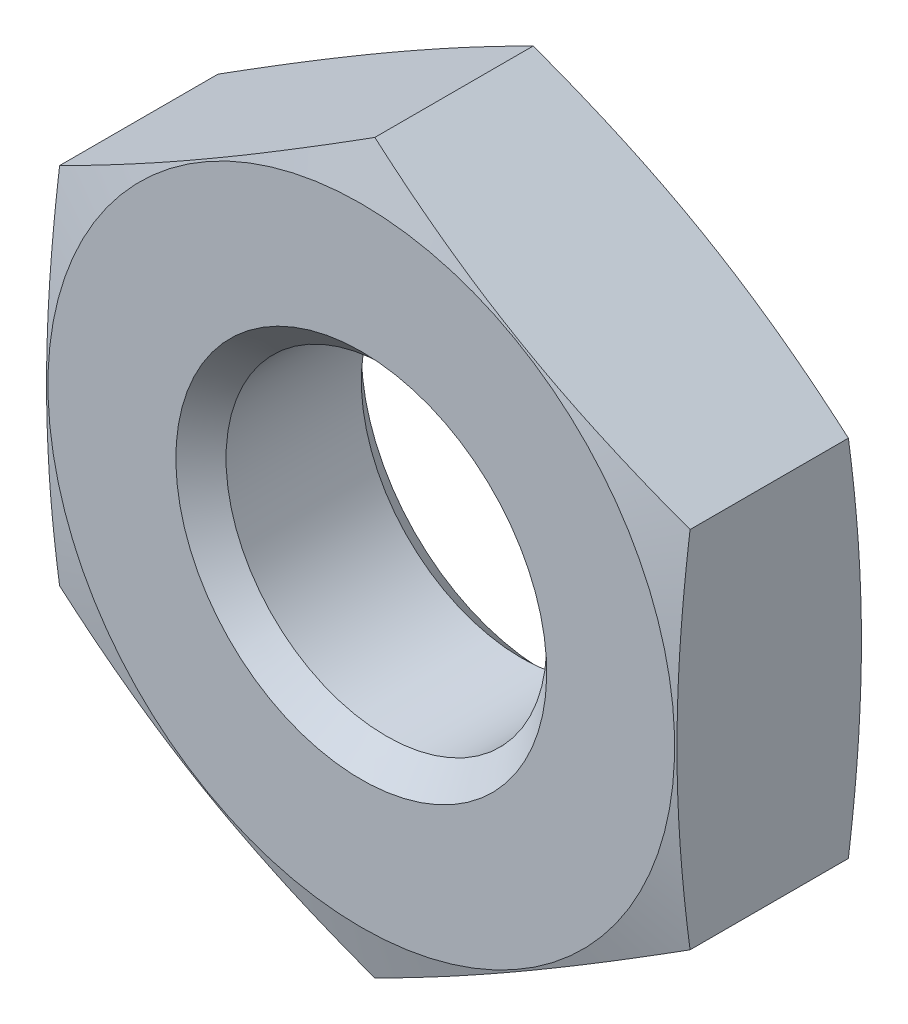
ISO-10303-21;
HEADER;
FILE_DESCRIPTION(('STEP AP214'),'2;1');
FILE_NAME('part.step','',(''),(''),'','','');
FILE_SCHEMA(('AUTOMOTIVE_DESIGN { 1 0 10303 214 1 1 1 1 }'));
ENDSEC;
DATA;
#1=APPLICATION_CONTEXT('core data for automotive mechanical design processes');
#2=APPLICATION_PROTOCOL_DEFINITION('international standard','automotive_design',2000,#1);
#3=PRODUCT_CONTEXT('',#1,'mechanical');
#4=PRODUCT('Part','Part','',(#3));
#5=PRODUCT_RELATED_PRODUCT_CATEGORY('part','',(#4));
#6=PRODUCT_DEFINITION_FORMATION('','',#4);
#7=PRODUCT_DEFINITION_CONTEXT('part definition',#1,'design');
#8=PRODUCT_DEFINITION('design','',#6,#7);
#9=PRODUCT_DEFINITION_SHAPE('','',#8);
#10=(LENGTH_UNIT() NAMED_UNIT(*) SI_UNIT(.MILLI.,.METRE.));
#11=(NAMED_UNIT(*) PLANE_ANGLE_UNIT() SI_UNIT($,.RADIAN.));
#12=(NAMED_UNIT(*) SI_UNIT($,.STERADIAN.) SOLID_ANGLE_UNIT());
#13=UNCERTAINTY_MEASURE_WITH_UNIT(LENGTH_MEASURE(1.E-05),#10,'distance_accuracy_value','');
#14=(GEOMETRIC_REPRESENTATION_CONTEXT(3) GLOBAL_UNCERTAINTY_ASSIGNED_CONTEXT((#13)) GLOBAL_UNIT_ASSIGNED_CONTEXT((#10,
#11,#12)) REPRESENTATION_CONTEXT('',''));
#15=CARTESIAN_POINT('',(0.,0.,0.));
#16=DIRECTION('',(0.,0.,1.));
#17=DIRECTION('',(1.,0.,0.));
#18=AXIS2_PLACEMENT_3D('',#15,#16,#17);
#19=CARTESIAN_POINT('',(-8.5,4.90747728811182,6.667));
#20=DIRECTION('',(0.5,-0.866025403784439,0.));
#21=DIRECTION('',(0.,0.,-1.));
#22=AXIS2_PLACEMENT_3D('',#19,#20,#21);
#23=PLANE('',#22);
#24=DIRECTION('',(0.,0.,1.));
#25=VECTOR('',#24,1.);
#26=CARTESIAN_POINT('',(-8.5,4.90747728811182,6.667));
#27=LINE('',#26,#25);
#28=CARTESIAN_POINT('',(-8.5,4.90747728811182,13.0327384764043));
#29=VERTEX_POINT('',#28);
#30=CARTESIAN_POINT('',(-8.5,4.90747728811182,17.3012615235957));
#31=VERTEX_POINT('',#30);
#32=EDGE_CURVE('E320',#29,#31,#27,.T.);
#33=ORIENTED_EDGE('',*,*,#32,.T.);
#34=CARTESIAN_POINT('',(0.,9.8149545762236,17.3012615235957));
#35=CARTESIAN_POINT('',(-0.180898159269028,9.71049903042365,17.3292495193082));
#36=CARTESIAN_POINT('',(-0.361941476855366,9.60593547794812,17.3559282074359));
#37=CARTESIAN_POINT('',(-0.720772382831821,9.3987083914887,17.4058769582953));
#38=CARTESIAN_POINT('',(-0.898553890734686,9.29604798273623,17.429203791207));
#39=CARTESIAN_POINT('',(-1.2517845161137,9.09215663528056,17.4724577700686));
#40=CARTESIAN_POINT('',(-1.4272288981087,8.99092719945775,17.492430409726));
#41=CARTESIAN_POINT('',(-1.77679219288645,8.78930186741603,17.5289781492053));
#42=CARTESIAN_POINT('',(-1.95090851688554,8.68890683472686,17.5455827096214));
#43=CARTESIAN_POINT('',(-2.30395826228766,8.48499972915376,17.575898136473));
#44=CARTESIAN_POINT('',(-2.48289358300263,8.38147730397616,17.5895177594154));
#45=CARTESIAN_POINT('',(-2.83836839128861,8.17583836719582,17.6128140992932));
#46=CARTESIAN_POINT('',(-3.01490507328591,8.07372319200837,17.6225450281326));
#47=CARTESIAN_POINT('',(-3.36736349614584,7.87014774309225,17.6380829550083));
#48=CARTESIAN_POINT('',(-3.5432839584829,7.76868672870259,17.6439091275708));
#49=CARTESIAN_POINT('',(-3.8961685465165,7.56527886711899,17.6516789870862));
#50=CARTESIAN_POINT('',(-4.0731332772547,7.4633322841041,17.6536020066666));
#51=CARTESIAN_POINT('',(-4.42683570929424,7.25911748625929,17.6536030739966));
#52=CARTESIAN_POINT('',(-4.60357344496381,7.15684933096186,17.6516817959));
#53=CARTESIAN_POINT('',(-4.95613035482277,6.95297033344451,17.6439142323722));
#54=CARTESIAN_POINT('',(-5.13194958103846,6.85135881453642,17.6380881724111));
#55=CARTESIAN_POINT('',(-5.48448350667436,6.6479156011383,17.6225500401738));
#56=CARTESIAN_POINT('',(-5.66119820803533,6.54608541931318,17.6128183352907));
#57=CARTESIAN_POINT('',(-6.01706616059865,6.34103095552903,17.5895204893277));
#58=CARTESIAN_POINT('',(-6.19621677787224,6.23780835556398,17.5758997087963));
#59=CARTESIAN_POINT('',(-6.54934245420602,6.03399476285778,17.5455851249058));
#60=CARTESIAN_POINT('',(-6.72332754931658,5.93340737887139,17.5289834579142));
#61=CARTESIAN_POINT('',(-7.07269906090232,5.73149793709869,17.4924394176123));
#62=CARTESIAN_POINT('',(-7.24808345207368,5.63017775260714,17.4724673957204));
#63=CARTESIAN_POINT('',(-7.60127478856458,5.42622048801649,17.4292132859889));
#64=CARTESIAN_POINT('',(-7.77907805845976,5.32358678644414,17.4058855204568));
#65=CARTESIAN_POINT('',(-8.13798035486786,5.11643522180768,17.3559333691342));
#66=CARTESIAN_POINT('',(-8.31907360797217,5.0119210591139,17.3292520336606));
#67=CARTESIAN_POINT('',(-8.49999999999997,4.90747728811179,17.3012615235957));
#68=B_SPLINE_CURVE_WITH_KNOTS('',3,(#34,#35,#36,#37,#38,#39,#40,#41,#42,#43,#44,#45,#46,#47,#48,
#49,#50,#51,#52,#53,#54,#55,#56,#57,#58,#59,#60,#61,#62,#63,#64,#65,#66,#67),.UNSPECIFIED.,.F.,
.F.,(4,2,2,2,2,2,2,2,2,2,2,2,2,2,2,2,4),(0.,0.6322725144393,1.25209623484148,1.86268064846303,
2.46766909863855,3.08915310428067,3.70164253008657,4.3111018132926,4.92377987966843,
5.53635051339146,6.14577250718081,6.75829705553949,7.37989066836482,7.98482616627779,
8.59539073500997,9.21523114762044,9.84755986695798),.UNSPECIFIED.);
#69=CARTESIAN_POINT('',(0.,9.81495457622364,17.3012615235957));
#70=VERTEX_POINT('',#69);
#71=EDGE_CURVE('E323',#70,#31,#68,.T.);
#72=ORIENTED_EDGE('',*,*,#71,.F.);
#73=DIRECTION('',(0.,0.,1.));
#74=VECTOR('',#73,1.);
#75=CARTESIAN_POINT('',(0.,9.81495457622364,6.667));
#76=LINE('',#75,#74);
#77=CARTESIAN_POINT('',(0.,9.81495457622364,13.0327384764043));
#78=VERTEX_POINT('',#77);
#79=EDGE_CURVE('E143',#78,#70,#76,.T.);
#80=ORIENTED_EDGE('',*,*,#79,.F.);
#81=CARTESIAN_POINT('',(-8.49999999999996,4.90747728811179,13.0327384764043));
#82=CARTESIAN_POINT('',(-8.3190897641333,5.0119119166385,13.0047504806912));
#83=CARTESIAN_POINT('',(-8.138013412583,5.11641825261747,12.978071792563));
#84=CARTESIAN_POINT('',(-7.7791340383641,5.32356138962803,12.928123041703));
#85=CARTESIAN_POINT('',(-7.60133676246893,5.42619448741889,12.9047962087911));
#86=CARTESIAN_POINT('',(-7.2481463632708,5.63015550866323,12.8615422299294));
#87=CARTESIAN_POINT('',(-7.07275690924101,5.7314800825099,12.8415695902722));
#88=CARTESIAN_POINT('',(-6.72336260226203,5.93339810999537,12.8050218507936));
#89=CARTESIAN_POINT('',(-6.54935979154338,6.0339897534466,12.788417290378));
#90=CARTESIAN_POINT('',(-6.19624618540725,6.23778624897839,12.7581018635272));
#91=CARTESIAN_POINT('',(-6.01712547498451,6.34098756976451,12.7444822405851));
#92=CARTESIAN_POINT('',(-5.66129952758222,6.54601831575713,12.7211859007076));
#93=CARTESIAN_POINT('',(-5.48459685075912,6.64784597947319,12.7114549718683));
#94=CARTESIAN_POINT('',(-5.1320661289808,6.85129620298954,12.6959170449926));
#95=CARTESIAN_POINT('',(-4.95623808185713,6.95291728522372,12.69009087243));
#96=CARTESIAN_POINT('',(-4.60363941237973,7.15682037227122,12.6823210129143));
#97=CARTESIAN_POINT('',(-4.42686871629094,7.25910303315552,12.6803979933335));
#98=CARTESIAN_POINT('',(-4.07316229751431,7.46331092575477,12.6803969260032));
#99=CARTESIAN_POINT('',(-3.896226609199,7.56523621699975,12.6823182040995));
#100=CARTESIAN_POINT('',(-3.54338376312884,7.76861995845468,12.690085767627));
#101=CARTESIAN_POINT('',(-3.36747599333167,7.87007811537665,12.695911827588));
#102=CARTESIAN_POINT('',(-3.01502203948417,8.07365984397521,12.7114499598254));
#103=CARTESIAN_POINT('',(-2.8384771644697,8.17578417366501,12.7211816647086));
#104=CARTESIAN_POINT('',(-2.48296081338422,8.38144762908967,12.7444795106718));
#105=CARTESIAN_POINT('',(-2.3039921109271,8.48498531477229,12.7581002912034));
#106=CARTESIAN_POINT('',(-1.95092152383663,8.68889432485275,12.7884148750937));
#107=CARTESIAN_POINT('',(-1.7768177464514,8.78927614510256,12.8050165420847));
#108=CARTESIAN_POINT('',(-1.42727328482315,8.99088602860501,12.8415605823859));
#109=CARTESIAN_POINT('',(-1.25183523555291,9.09211327454047,12.8615326042777));
#110=CARTESIAN_POINT('',(-0.89860739488612,9.29600731204336,12.9047867140092));
#111=CARTESIAN_POINT('',(-0.720822367091751,9.39867260986332,12.9281144795414));
#112=CARTESIAN_POINT('',(-0.361972701475146,9.60591533371416,12.9780666308648));
#113=CARTESIAN_POINT('',(-0.180914154971916,9.71048961001167,13.0047479663388));
#114=CARTESIAN_POINT('',(0.,9.8149545762236,13.0327384764043));
#115=B_SPLINE_CURVE_WITH_KNOTS('',3,(#81,#82,#83,#84,#85,#86,#87,#88,#89,#90,#91,#92,#93,#94,
#95,#96,#97,#98,#99,#100,#101,#102,#103,#104,#105,#106,#107,#108,#109,#110,#111,#112,#113,#114),
.UNSPECIFIED.,.F.,.F.,(4,2,2,2,2,2,2,2,2,2,2,2,2,2,2,2,4),(0.,0.632272514450517,
1.25209623485603,1.86268064847362,2.46766909863858,3.08915310428301,3.70164253008991,
4.31110181329527,4.92377987966839,5.5363505133726,6.14577250715544,6.75829705552028,
7.37989066836476,7.98482616626732,8.5953907349956,9.21523114760935,9.84755986695794),.UNSPECIFIED.);
#116=EDGE_CURVE('E324',#29,#78,#115,.T.);
#117=ORIENTED_EDGE('',*,*,#116,.F.);
#118=EDGE_LOOP('',(#33,#72,#80,#117));
#119=FACE_BOUND('',#118,.T.);
#120=ADVANCED_FACE('F16',(#119),#23,.F.);
#121=CARTESIAN_POINT('',(0.,0.,12.667));
#122=DIRECTION('',(0.,0.,-1.));
#123=DIRECTION('',(0.,-1.,0.));
#124=AXIS2_PLACEMENT_3D('',#121,#122,#123);
#125=CONICAL_SURFACE('',#124,5.,0.785398163397448);
#126=CARTESIAN_POINT('',(0.,0.,13.3435));
#127=DIRECTION('',(0.,0.,1.));
#128=DIRECTION('',(0.,1.,0.));
#129=AXIS2_PLACEMENT_3D('',#126,#127,#128);
#130=CIRCLE('',#129,4.3235);
#131=CARTESIAN_POINT('',(0.,4.3235,13.3435));
#132=VERTEX_POINT('',#131);
#133=EDGE_CURVE('E11',#132,#132,#130,.T.);
#134=ORIENTED_EDGE('',*,*,#133,.T.);
#135=EDGE_LOOP('',(#134));
#136=FACE_BOUND('',#135,.T.);
#137=CARTESIAN_POINT('',(0.,0.,12.667));
#138=DIRECTION('',(0.,0.,1.));
#139=DIRECTION('',(0.,1.,0.));
#140=AXIS2_PLACEMENT_3D('',#137,#138,#139);
#141=CIRCLE('',#140,5.);
#142=CARTESIAN_POINT('',(0.,5.,12.667));
#143=VERTEX_POINT('',#142);
#144=EDGE_CURVE('E102',#143,#143,#141,.T.);
#145=ORIENTED_EDGE('',*,*,#144,.F.);
#146=EDGE_LOOP('',(#145));
#147=FACE_BOUND('',#146,.T.);
#148=ADVANCED_FACE('F183',(#136,#147),#125,.F.);
#149=CARTESIAN_POINT('',(0.,0.,17.667));
#150=DIRECTION('',(0.,0.,-1.));
#151=DIRECTION('',(0.,1.,0.));
#152=AXIS2_PLACEMENT_3D('',#149,#150,#151);
#153=CYLINDRICAL_SURFACE('',#152,4.3235);
#154=CARTESIAN_POINT('',(0.,0.,16.9905));
#155=DIRECTION('',(0.,0.,1.));
#156=DIRECTION('',(0.,1.,0.));
#157=AXIS2_PLACEMENT_3D('',#154,#155,#156);
#158=CIRCLE('',#157,4.3235);
#159=CARTESIAN_POINT('',(0.,4.3235,16.9905));
#160=VERTEX_POINT('',#159);
#161=EDGE_CURVE('E29',#160,#160,#158,.T.);
#162=ORIENTED_EDGE('',*,*,#161,.T.);
#163=EDGE_LOOP('',(#162));
#164=FACE_BOUND('',#163,.T.);
#165=ORIENTED_EDGE('',*,*,#133,.F.);
#166=EDGE_LOOP('',(#165));
#167=FACE_BOUND('',#166,.T.);
#168=ADVANCED_FACE('F231',(#164,#167),#153,.F.);
#169=CARTESIAN_POINT('',(0.,0.,16.9905));
#170=DIRECTION('',(0.,0.,1.));
#171=DIRECTION('',(0.,1.,0.));
#172=AXIS2_PLACEMENT_3D('',#169,#170,#171);
#173=CONICAL_SURFACE('',#172,4.3235,0.785398163397448);
#174=ORIENTED_EDGE('',*,*,#161,.F.);
#175=EDGE_LOOP('',(#174));
#176=FACE_BOUND('',#175,.T.);
#177=CARTESIAN_POINT('',(0.,0.,17.667));
#178=DIRECTION('',(0.,0.,1.));
#179=DIRECTION('',(0.,1.,0.));
#180=AXIS2_PLACEMENT_3D('',#177,#178,#179);
#181=CIRCLE('',#180,5.);
#182=CARTESIAN_POINT('',(0.,5.,17.667));
#183=VERTEX_POINT('',#182);
#184=EDGE_CURVE('E127',#183,#183,#181,.T.);
#185=ORIENTED_EDGE('',*,*,#184,.T.);
#186=EDGE_LOOP('',(#185));
#187=FACE_BOUND('',#186,.T.);
#188=ADVANCED_FACE('F181',(#176,#187),#173,.F.);
#189=CARTESIAN_POINT('',(0.,0.,12.667));
#190=DIRECTION('',(0.,0.,1.));
#191=DIRECTION('',(0.,1.,0.));
#192=AXIS2_PLACEMENT_3D('',#189,#190,#191);
#193=CONICAL_SURFACE('',#192,8.45,1.30899693899575);
#194=CARTESIAN_POINT('',(0.,0.,12.667));
#195=DIRECTION('',(0.,0.,1.));
#196=DIRECTION('',(0.,1.,0.));
#197=AXIS2_PLACEMENT_3D('',#194,#195,#196);
#198=CIRCLE('',#197,8.45);
#199=CARTESIAN_POINT('',(0.,8.45,12.667));
#200=VERTEX_POINT('',#199);
#201=EDGE_CURVE('E95',#200,#200,#198,.T.);
#202=ORIENTED_EDGE('',*,*,#201,.T.);
#203=EDGE_LOOP('',(#202));
#204=FACE_BOUND('',#203,.T.);
#205=CARTESIAN_POINT('',(-8.50000000000001,-4.90747728811181,13.0327384764043));
#206=CARTESIAN_POINT('',(-8.49998804949958,-4.69912330621786,13.0048223426871));
#207=CARTESIAN_POINT('',(-8.4999550583825,-4.49059056104943,12.9782087648925));
#208=CARTESIAN_POINT('',(-8.49990608340058,-4.07727693297842,12.9283722699153));
#209=CARTESIAN_POINT('',(-8.4998897781384,-3.87250282917264,12.9050930107947));
#210=CARTESIAN_POINT('',(-8.49992797569012,-3.46568025087529,12.8619162886143));
#211=CARTESIAN_POINT('',(-8.49998142761244,-3.26363660102455,12.8419736252374));
#212=CARTESIAN_POINT('',(-8.50014745847232,-2.86111499925302,12.8054680685428));
#213=CARTESIAN_POINT('',(-8.50025948969209,-2.66063971617757,12.7888758081316));
#214=CARTESIAN_POINT('',(-8.50019597133483,-2.25360055638767,12.7585389042182));
#215=CARTESIAN_POINT('',(-8.50001195071071,-2.04702940993457,12.7448912751096));
#216=CARTESIAN_POINT('',(-8.49966405367234,-1.6366602718184,12.7215319230742));
#217=CARTESIAN_POINT('',(-8.49949992441472,-1.43286538024442,12.7117661321245));
#218=CARTESIAN_POINT('',(-8.49942895636924,-1.02613724427347,12.6961511838715));
#219=CARTESIAN_POINT('',(-8.49952084503455,-0.823204741710944,12.6902828339856));
#220=CARTESIAN_POINT('',(-8.49980951045991,-0.41620077909365,12.6824230687073));
#221=CARTESIAN_POINT('',(-8.50000683461147,-0.212128925803289,12.6804521409877));
#222=CARTESIAN_POINT('',(-8.4999931481093,0.196531721305764,12.6803446887292));
#223=CARTESIAN_POINT('',(-8.49978110384377,0.40112051766991,12.6822178709119));
#224=CARTESIAN_POINT('',(-8.49944701164931,0.809081309034491,12.6898983625856));
#225=CARTESIAN_POINT('',(-8.49932446754574,1.01245371634854,12.6956836343598));
#226=CARTESIAN_POINT('',(-8.49934060335995,1.41999884011989,12.7111506005439));
#227=CARTESIAN_POINT('',(-8.49948050372199,1.62417086766314,12.7208503336705));
#228=CARTESIAN_POINT('',(-8.49979324960805,2.03524581553728,12.7440944519168));
#229=CARTESIAN_POINT('',(-8.49996654079566,2.24214569495056,12.7576922211172));
#230=CARTESIAN_POINT('',(-8.50003259105913,2.65031947250588,12.7879880877968));
#231=CARTESIAN_POINT('',(-8.49993251226539,2.85160005647293,12.8045965887659));
#232=CARTESIAN_POINT('',(-8.49980598385126,3.25579891506852,12.8411726459449));
#233=CARTESIAN_POINT('',(-8.49978024863682,3.45871441026543,12.8611708517424));
#234=CARTESIAN_POINT('',(-8.49979923695309,3.86737024799275,12.9044959452448));
#235=CARTESIAN_POINT('',(-8.49984505932643,4.07310559848682,12.9278696438263));
#236=CARTESIAN_POINT('',(-8.49993944695423,4.48845111834922,12.97793222243));
#237=CARTESIAN_POINT('',(-8.49998804917399,4.69805429775054,13.0046792219888));
#238=CARTESIAN_POINT('',(-8.5,4.90747728811182,13.0327384764043));
#239=B_SPLINE_CURVE_WITH_KNOTS('',3,(#205,#206,#207,#208,#209,#210,#211,#212,#213,#214,#215,
#216,#217,#218,#219,#220,#221,#222,#223,#224,#225,#226,#227,#228,#229,#230,#231,#232,#233,#234,
#235,#236,#237,#238),.UNSPECIFIED.,.F.,.F.,(4,2,2,2,2,2,2,2,2,2,2,2,2,2,2,2,4),(0.,
0.630649519121497,1.24890904564011,1.85796115460387,2.46141783591299,3.08245065298349,
3.69450185812719,4.30351627440208,4.91572368985353,5.52947888582182,6.13980514372528,
6.75297663669831,7.37498337649167,7.98085129352522,8.59252225107596,9.21367882285828,
9.84756412725215),.UNSPECIFIED.);
#240=CARTESIAN_POINT('',(-8.5,-4.90747728811182,13.0327384764043));
#241=VERTEX_POINT('',#240);
#242=EDGE_CURVE('E164',#241,#29,#239,.T.);
#243=ORIENTED_EDGE('',*,*,#242,.T.);
#244=ORIENTED_EDGE('',*,*,#116,.T.);
#245=CARTESIAN_POINT('',(0.,9.8149545762236,13.0327384764043));
#246=CARTESIAN_POINT('',(0.180898159264348,9.71049903042639,13.0047504806925));
#247=CARTESIAN_POINT('',(0.361941476846258,9.60593547795398,12.9780717925656));
#248=CARTESIAN_POINT('',(0.720772382817265,9.39870839149912,12.9281230417072));
#249=CARTESIAN_POINT('',(0.898553890719113,9.29604798274807,12.9047962087958));
#250=CARTESIAN_POINT('',(1.25178451609894,9.09215663529318,12.8615422299341));
#251=CARTESIAN_POINT('',(1.42722889809577,8.99092719946971,12.8415695902766));
#252=CARTESIAN_POINT('',(1.77679219287904,8.78930186742353,12.8050218507962));
#253=CARTESIAN_POINT('',(1.95090851688181,8.68890683473057,12.7884172903793));
#254=CARTESIAN_POINT('',(2.30395826228,8.48499972915663,12.7581018635272));
#255=CARTESIAN_POINT('',(2.48289358298733,8.38147730398203,12.744482240585));
#256=CARTESIAN_POINT('',(2.8383683912638,8.17583836720668,12.7211859007073));
#257=CARTESIAN_POINT('',(3.01490507325921,8.07372319202119,12.7114549718681));
#258=CARTESIAN_POINT('',(3.36736349612008,7.87014774310649,12.6959170449925));
#259=CARTESIAN_POINT('',(3.54328395845998,7.76868672871628,12.6900908724299));
#260=CARTESIAN_POINT('',(3.89616854650314,7.56527886712782,12.6823210129142));
#261=CARTESIAN_POINT('',(4.07313327724808,7.46333228410863,12.6803979933335));
#262=CARTESIAN_POINT('',(4.42683570929088,7.25911748626056,12.6803969260032));
#263=CARTESIAN_POINT('',(4.603573444957,7.15684933096419,12.6823182040995));
#264=CARTESIAN_POINT('',(4.95613035481158,6.95297033344881,12.690085767627));
#265=CARTESIAN_POINT('',(5.13194958102636,6.85135881454163,12.695911827588));
#266=CARTESIAN_POINT('',(5.48448350666255,6.64791560114423,12.7114499598254));
#267=CARTESIAN_POINT('',(5.66119820802473,6.54608541931893,12.7211816647086));
#268=CARTESIAN_POINT('',(6.01706616059242,6.34103095553277,12.7444795106718));
#269=CARTESIAN_POINT('',(6.19621677786918,6.2378083555659,12.7581002912034));
#270=CARTESIAN_POINT('',(6.54934245420528,6.03399476285803,12.788414875094));
#271=CARTESIAN_POINT('',(6.72332754931501,5.93340737887181,12.8050165420855));
#272=CARTESIAN_POINT('',(7.07269906089971,5.73149793709949,12.8415605823873));
#273=CARTESIAN_POINT('',(7.24808345207084,5.63017775260816,12.8615326042792));
#274=CARTESIAN_POINT('',(7.60127478856178,5.42622048801769,12.9047867140107));
#275=CARTESIAN_POINT('',(7.77907805845722,5.32358678644531,12.9281144795427));
#276=CARTESIAN_POINT('',(8.13798035486636,5.11643522180848,12.9780666308656));
#277=CARTESIAN_POINT('',(8.31907360797143,5.01192105911433,13.0047479663392));
#278=CARTESIAN_POINT('',(8.49999999999996,4.90747728811181,13.0327384764043));
#279=B_SPLINE_CURVE_WITH_KNOTS('',3,(#245,#246,#247,#248,#249,#250,#251,#252,#253,#254,#255,
#256,#257,#258,#259,#260,#261,#262,#263,#264,#265,#266,#267,#268,#269,#270,#271,#272,#273,#274,
#275,#276,#277,#278),.UNSPECIFIED.,.F.,.F.,(4,2,2,2,2,2,2,2,2,2,2,2,2,2,2,2,4),(0.,
0.632272514422947,1.25209623482028,1.86268064844761,2.46766909863857,3.08915310425639,
3.7016425300544,4.31110181326865,4.92377987966842,5.53635051338088,6.14577250716647,
6.75829705552859,7.37989066836487,7.98482616627543,8.5953907350067,9.21523114761791,
9.847559866958),.UNSPECIFIED.);
#280=CARTESIAN_POINT('',(8.5,4.90747728811182,13.0327384764043));
#281=VERTEX_POINT('',#280);
#282=EDGE_CURVE('E136',#78,#281,#279,.T.);
#283=ORIENTED_EDGE('',*,*,#282,.T.);
#284=CARTESIAN_POINT('',(8.5,4.90747728811183,13.0327384764043));
#285=CARTESIAN_POINT('',(8.49998820336503,4.69807223265437,13.0046816510301));
#286=CARTESIAN_POINT('',(8.49994122143252,4.48848697585402,12.9779372096838));
#287=CARTESIAN_POINT('',(8.49985086576335,4.07316470460885,12.9278779168189));
#288=CARTESIAN_POINT('',(8.49980743861756,3.86743465920946,12.9045051194216));
#289=CARTESIAN_POINT('',(8.49979205359619,3.45877778817918,12.8611801526715));
#290=CARTESIAN_POINT('',(8.49981901840685,3.2558559354175,12.8411813506437));
#291=CARTESIAN_POINT('',(8.49994170861627,2.85163385804009,12.8046017184172));
#292=CARTESIAN_POINT('',(8.50003678288488,2.65033639646819,12.7879904210902));
#293=CARTESIAN_POINT('',(8.49996224691089,2.24218089398293,12.7576937281354));
#294=CARTESIAN_POINT('',(8.49978558906885,2.03531623113209,12.7440970644091));
#295=CARTESIAN_POINT('',(8.49947326973169,1.62428777618129,12.7208543839547));
#296=CARTESIAN_POINT('',(8.49933706561857,1.42012700169145,12.7111553968787));
#297=CARTESIAN_POINT('',(8.49932833473601,1.01258117856334,12.6956886287154));
#298=CARTESIAN_POINT('',(8.49945461719041,0.809196801821614,12.6899032512893));
#299=CARTESIAN_POINT('',(8.49978871230942,0.401189543016611,12.6822205592816));
#300=CARTESIAN_POINT('',(8.49999698788854,0.196566240552579,12.6803457079489));
#301=CARTESIAN_POINT('',(8.50000300350207,-0.212094515388131,12.680451106583));
#302=CARTESIAN_POINT('',(8.49980191525115,-0.41613197167432,12.6824203529953));
#303=CARTESIAN_POINT('',(8.49951322948276,-0.823089608193165,12.6902779014664));
#304=CARTESIAN_POINT('',(8.49942505768735,-1.02601017340895,12.6961461401831));
#305=CARTESIAN_POINT('',(8.49950339348521,-1.43273760402416,12.7117612857471));
#306=CARTESIAN_POINT('',(8.49967120248092,-1.63654371045963,12.7215278248177));
#307=CARTESIAN_POINT('',(8.50001954682942,-2.04695920044107,12.7448886354822));
#308=CARTESIAN_POINT('',(8.50020023370365,-2.25356546064348,12.7585373855319));
#309=CARTESIAN_POINT('',(8.5002553410593,-2.66062288603024,12.7888734880641));
#310=CARTESIAN_POINT('',(8.50013835761638,-2.86108138441229,12.8054629704321));
#311=CARTESIAN_POINT('',(8.49996853077318,-3.26357989950108,12.8419649750834));
#312=CARTESIAN_POINT('',(8.49991629570403,-3.46561723115349,12.8619070445662));
#313=CARTESIAN_POINT('',(8.49988166423018,-3.87243878799822,12.9050838921465));
#314=CARTESIAN_POINT('',(8.4999003397072,-4.07721816958788,12.9283640467535));
#315=CARTESIAN_POINT('',(8.49995330228675,-4.49055491384659,12.9782038076024));
#316=CARTESIAN_POINT('',(8.49998789565229,-4.69910547669762,13.0048199276797));
#317=CARTESIAN_POINT('',(8.49999999999999,-4.90747728811183,13.0327384764043));
#318=B_SPLINE_CURVE_WITH_KNOTS('',3,(#284,#285,#286,#287,#288,#289,#290,#291,#292,#293,#294,
#295,#296,#297,#298,#299,#300,#301,#302,#303,#304,#305,#306,#307,#308,#309,#310,#311,#312,#313,
#314,#315,#316,#317),.UNSPECIFIED.,.F.,.F.,(4,2,2,2,2,2,2,2,2,2,2,2,2,2,2,2,4),(0.,
0.633831001456041,1.25497145049955,1.86666158375951,2.47258065356488,3.09448175531222,
3.70761938991571,4.31798158372511,4.93184033453,5.5439445190961,6.15292309719023,
6.76500804790367,7.38614619592557,7.9895520073961,8.59858505880868,9.21686062381816,
9.84756412728116),.UNSPECIFIED.);
#319=CARTESIAN_POINT('',(8.5,-4.90747728811182,13.0327384764043));
#320=VERTEX_POINT('',#319);
#321=EDGE_CURVE('E131',#281,#320,#318,.T.);
#322=ORIENTED_EDGE('',*,*,#321,.T.);
#323=CARTESIAN_POINT('',(8.49999999999996,-4.90747728811181,13.0327384764043));
#324=CARTESIAN_POINT('',(8.31908976413467,-5.01191191663772,13.0047504806915));
#325=CARTESIAN_POINT('',(8.13801341258582,-5.11641825261602,12.9780717925635));
#326=CARTESIAN_POINT('',(7.77913403836889,-5.32356138962585,12.9281230417037));
#327=CARTESIAN_POINT('',(7.60133676247424,-5.42619448741666,12.9047962087919));
#328=CARTESIAN_POINT('',(7.24814636327619,-5.63015550866131,12.8615422299303));
#329=CARTESIAN_POINT('',(7.07275690924596,-5.73148008250835,12.8415695902729));
#330=CARTESIAN_POINT('',(6.72336260226504,-5.93339810999458,12.8050218507941));
#331=CARTESIAN_POINT('',(6.54935979154489,-6.03398975344621,12.7884172903782));
#332=CARTESIAN_POINT('',(6.19624618540838,-6.23778624897725,12.7581018635272));
#333=CARTESIAN_POINT('',(6.01712547498677,-6.34098756976223,12.744482240585));
#334=CARTESIAN_POINT('',(5.66129952758611,-6.54601831575355,12.7211859007075));
#335=CARTESIAN_POINT('',(5.48459685076351,-6.64784597946944,12.7114549718682));
#336=CARTESIAN_POINT('',(5.13206612898535,-6.85129620298608,12.6959170449926));
#337=CARTESIAN_POINT('',(4.95623808186135,-6.9529172852207,12.69009087243));
#338=CARTESIAN_POINT('',(4.60363941238232,-7.15682037226953,12.6823210129143));
#339=CARTESIAN_POINT('',(4.42686871629225,-7.25910303315471,12.6803979933335));
#340=CARTESIAN_POINT('',(4.07316229751467,-7.46331092575463,12.6803969260032));
#341=CARTESIAN_POINT('',(3.8962266091997,-7.56523621699941,12.6823182040995));
#342=CARTESIAN_POINT('',(3.54338376313002,-7.76861995845413,12.690085767627));
#343=CARTESIAN_POINT('',(3.367475993333,-7.87007811537609,12.695911827588));
#344=CARTESIAN_POINT('',(3.01502203948555,-8.07365984397473,12.7114499598254));
#345=CARTESIAN_POINT('',(2.83847716447097,-8.17578417366461,12.7211816647087));
#346=CARTESIAN_POINT('',(2.48296081338501,-8.38144762908946,12.7444795106719));
#347=CARTESIAN_POINT('',(2.3039921109275,-8.48498531477219,12.7581002912034));
#348=CARTESIAN_POINT('',(1.95092152383692,-8.68889432485246,12.7884148750936));
#349=CARTESIAN_POINT('',(1.77681774645196,-8.78927614510201,12.8050165420846));
#350=CARTESIAN_POINT('',(1.4272732848241,-8.99088602860413,12.8415605823858));
#351=CARTESIAN_POINT('',(1.251835235554,-9.09211327453954,12.8615326042775));
#352=CARTESIAN_POINT('',(0.898607394887273,-9.29600731204249,12.904786714009));
#353=CARTESIAN_POINT('',(0.720822367092832,-9.39867260986255,12.9281144795413));
#354=CARTESIAN_POINT('',(0.361972701475829,-9.60591533371372,12.9780666308647));
#355=CARTESIAN_POINT('',(0.180914154972276,-9.71048961001147,13.0047479663388));
#356=CARTESIAN_POINT('',(0.,-9.8149545762236,13.0327384764043));
#357=B_SPLINE_CURVE_WITH_KNOTS('',3,(#323,#324,#325,#326,#327,#328,#329,#330,#331,#332,#333,
#334,#335,#336,#337,#338,#339,#340,#341,#342,#343,#344,#345,#346,#347,#348,#349,#350,#351,#352,
#353,#354,#355,#356),.UNSPECIFIED.,.F.,.F.,(4,2,2,2,2,2,2,2,2,2,2,2,2,2,2,2,4),(0.,
0.632272514445692,1.25209623484977,1.86268064846906,2.46766909863855,3.08915310427835,
3.70164253008371,4.31110181329062,4.92377987966839,5.53635051337142,6.14577250715387,
6.75829705551909,7.37989066836473,7.98482616626616,8.59539073499401,9.21523114760812,
9.84755986695791),.UNSPECIFIED.);
#358=CARTESIAN_POINT('',(0.,-9.81495457622364,13.0327384764043));
#359=VERTEX_POINT('',#358);
#360=EDGE_CURVE('E114',#320,#359,#357,.T.);
#361=ORIENTED_EDGE('',*,*,#360,.T.);
#362=CARTESIAN_POINT('',(0.,-9.8149545762236,13.0327384764043));
#363=CARTESIAN_POINT('',(-0.180898159264376,-9.71049903042639,13.0047504806925));
#364=CARTESIAN_POINT('',(-0.361941476846288,-9.60593547795398,12.9780717925656));
#365=CARTESIAN_POINT('',(-0.720772382817295,-9.39870839149912,12.9281230417072));
#366=CARTESIAN_POINT('',(-0.898553890719139,-9.29604798274807,12.9047962087958));
#367=CARTESIAN_POINT('',(-1.25178451609896,-9.09215663529318,12.8615422299341));
#368=CARTESIAN_POINT('',(-1.42722889809579,-8.99092719946971,12.8415695902766));
#369=CARTESIAN_POINT('',(-1.77679219287904,-8.78930186742353,12.8050218507962));
#370=CARTESIAN_POINT('',(-1.9509085168818,-8.68890683473057,12.7884172903793));
#371=CARTESIAN_POINT('',(-2.30395826227997,-8.48499972915663,12.7581018635272));
#372=CARTESIAN_POINT('',(-2.48289358298731,-8.38147730398204,12.744482240585));
#373=CARTESIAN_POINT('',(-2.83836839126379,-8.17583836720668,12.7211859007073));
#374=CARTESIAN_POINT('',(-3.01490507325921,-8.0737231920212,12.7114549718681));
#375=CARTESIAN_POINT('',(-3.36736349612009,-7.87014774310649,12.6959170449925));
#376=CARTESIAN_POINT('',(-3.54328395845998,-7.76868672871628,12.6900908724299));
#377=CARTESIAN_POINT('',(-3.89616854650316,-7.56527886712782,12.6823210129142));
#378=CARTESIAN_POINT('',(-4.07313327724809,-7.46333228410862,12.6803979933335));
#379=CARTESIAN_POINT('',(-4.42683570929089,-7.25911748626055,12.6803969260032));
#380=CARTESIAN_POINT('',(-4.60357344495701,-7.15684933096418,12.6823182040995));
#381=CARTESIAN_POINT('',(-4.95613035481159,-6.95297033344881,12.690085767627));
#382=CARTESIAN_POINT('',(-5.13194958102637,-6.85135881454162,12.695911827588));
#383=CARTESIAN_POINT('',(-5.48448350666255,-6.64791560114423,12.7114499598254));
#384=CARTESIAN_POINT('',(-5.66119820802473,-6.54608541931893,12.7211816647086));
#385=CARTESIAN_POINT('',(-6.01706616059241,-6.34103095553278,12.7444795106718));
#386=CARTESIAN_POINT('',(-6.19621677786916,-6.23780835556592,12.7581002912034));
#387=CARTESIAN_POINT('',(-6.54934245420526,-6.03399476285805,12.788414875094));
#388=CARTESIAN_POINT('',(-6.723327549315,-5.93340737887183,12.8050165420855));
#389=CARTESIAN_POINT('',(-7.0726990608997,-5.73149793709949,12.8415605823873));
#390=CARTESIAN_POINT('',(-7.24808345207084,-5.63017775260816,12.8615326042792));
#391=CARTESIAN_POINT('',(-7.60127478856178,-5.42622048801768,12.9047867140107));
#392=CARTESIAN_POINT('',(-7.77907805845723,-5.3235867864453,12.9281144795427));
#393=CARTESIAN_POINT('',(-8.13798035486637,-5.11643522180846,12.9780666308656));
#394=CARTESIAN_POINT('',(-8.31907360797144,-5.01192105911432,13.0047479663392));
#395=CARTESIAN_POINT('',(-8.49999999999997,-4.90747728811179,13.0327384764043));
#396=B_SPLINE_CURVE_WITH_KNOTS('',3,(#362,#363,#364,#365,#366,#367,#368,#369,#370,#371,#372,
#373,#374,#375,#376,#377,#378,#379,#380,#381,#382,#383,#384,#385,#386,#387,#388,#389,#390,#391,
#392,#393,#394,#395),.UNSPECIFIED.,.F.,.F.,(4,2,2,2,2,2,2,2,2,2,2,2,2,2,2,2,4),(0.,
0.632272514422958,1.25209623482029,1.86268064844761,2.46766909863852,3.08915310425636,
3.70164253005439,4.31110181326864,4.92377987966842,5.53635051338087,6.14577250716646,
6.75829705552857,7.37989066836483,7.9848261662754,8.59539073500668,9.2152311476179,
9.84755986695799),.UNSPECIFIED.);
#397=EDGE_CURVE('E364',#359,#241,#396,.T.);
#398=ORIENTED_EDGE('',*,*,#397,.T.);
#399=EDGE_LOOP('',(#243,#244,#283,#322,#361,#398));
#400=FACE_BOUND('',#399,.T.);
#401=ADVANCED_FACE('F134',(#204,#400),#193,.T.);
#402=CARTESIAN_POINT('',(0.,0.,12.667));
#403=DIRECTION('',(0.,0.,1.));
#404=DIRECTION('',(0.,1.,0.));
#405=AXIS2_PLACEMENT_3D('',#402,#403,#404);
#406=PLANE('',#405);
#407=ORIENTED_EDGE('',*,*,#144,.T.);
#408=EDGE_LOOP('',(#407));
#409=FACE_BOUND('',#408,.T.);
#410=ORIENTED_EDGE('',*,*,#201,.F.);
#411=EDGE_LOOP('',(#410));
#412=FACE_BOUND('',#411,.T.);
#413=ADVANCED_FACE('F180',(#409,#412),#406,.F.);
#414=CARTESIAN_POINT('',(0.,-9.81495457622364,6.667));
#415=DIRECTION('',(0.5,0.866025403784439,0.));
#416=DIRECTION('',(0.866025403784439,-0.5,0.));
#417=AXIS2_PLACEMENT_3D('',#414,#415,#416);
#418=PLANE('',#417);
#419=DIRECTION('',(0.,0.,1.));
#420=VECTOR('',#419,1.);
#421=CARTESIAN_POINT('',(0.,-9.81495457622364,6.667));
#422=LINE('',#421,#420);
#423=CARTESIAN_POINT('',(0.,-9.81495457622364,17.3012615235957));
#424=VERTEX_POINT('',#423);
#425=EDGE_CURVE('E122',#359,#424,#422,.T.);
#426=ORIENTED_EDGE('',*,*,#425,.T.);
#427=CARTESIAN_POINT('',(-8.49999999999996,-4.90747728811179,17.3012615235957));
#428=CARTESIAN_POINT('',(-8.31908976413343,-5.01191191663842,17.3292495193087));
#429=CARTESIAN_POINT('',(-8.13801341258327,-5.11641825261733,17.3559282074369));
#430=CARTESIAN_POINT('',(-7.77913403836456,-5.32356138962781,17.4058769582969));
#431=CARTESIAN_POINT('',(-7.60133676246944,-5.42619448741867,17.4292037912088));
#432=CARTESIAN_POINT('',(-7.24814636327132,-5.63015550866304,17.4724577700705));
#433=CARTESIAN_POINT('',(-7.07275690924149,-5.73148008250974,17.4924304097277));
#434=CARTESIAN_POINT('',(-6.72336260226231,-5.93339810999528,17.5289781492063));
#435=CARTESIAN_POINT('',(-6.54935979154352,-6.03398975344655,17.545582709622));
#436=CARTESIAN_POINT('',(-6.19624618540758,-6.23778624897814,17.5758981364728));
#437=CARTESIAN_POINT('',(-6.0171254749852,-6.34098756976403,17.5895177594149));
#438=CARTESIAN_POINT('',(-5.6612995275834,-6.54601831575641,17.6128140992923));
#439=CARTESIAN_POINT('',(-5.48459685076045,-6.64784597947245,17.6225450281316));
#440=CARTESIAN_POINT('',(-5.13206612898215,-6.85129620298887,17.6380829550073));
#441=CARTESIAN_POINT('',(-4.95623808185837,-6.95291728522314,17.6439091275699));
#442=CARTESIAN_POINT('',(-4.6036394123805,-7.15682037227093,17.6516789870857));
#443=CARTESIAN_POINT('',(-4.42686871629136,-7.25910303315544,17.6536020066664));
#444=CARTESIAN_POINT('',(-4.07316229751181,-7.46331092575603,17.6536030739969));
#445=CARTESIAN_POINT('',(-3.89622660919394,-7.56523621700213,17.6516817959005));
#446=CARTESIAN_POINT('',(-3.54338376312019,-7.76861995845829,17.6439142323731));
#447=CARTESIAN_POINT('',(-3.36747599332202,-7.87007811538036,17.638088172412));
#448=CARTESIAN_POINT('',(-3.01502203947423,-8.07365984397841,17.6225500401747));
#449=CARTESIAN_POINT('',(-2.83847716446048,-8.1757841736676,17.6128183352915));
#450=CARTESIAN_POINT('',(-2.48296081337855,-8.38144762909099,17.5895204893282));
#451=CARTESIAN_POINT('',(-2.30399211092427,-8.48498531477296,17.5758997087966));
#452=CARTESIAN_POINT('',(-1.9509215238345,-8.68889432485493,17.5455851249059));
#453=CARTESIAN_POINT('',(-1.77681774644712,-8.78927614510691,17.5289834579144));
#454=CARTESIAN_POINT('',(-1.42727328481567,-8.99088602861191,17.4924394176125));
#455=CARTESIAN_POINT('',(-1.25183523554438,-9.09211327454775,17.4724673957206));
#456=CARTESIAN_POINT('',(-0.898607394877128,-9.2960073120502,17.4292132859892));
#457=CARTESIAN_POINT('',(-0.72082236708335,-9.39867260986933,17.4058855204571));
#458=CARTESIAN_POINT('',(-0.361972701469894,-9.60591533371754,17.3559333691343));
#459=CARTESIAN_POINT('',(-0.180914154969222,-9.71048961001325,17.3292520336607));
#460=CARTESIAN_POINT('',(0.,-9.8149545762236,17.3012615235957));
#461=B_SPLINE_CURVE_WITH_KNOTS('',3,(#427,#428,#429,#430,#431,#432,#433,#434,#435,#436,#437,
#438,#439,#440,#441,#442,#443,#444,#445,#446,#447,#448,#449,#450,#451,#452,#453,#454,#455,#456,
#457,#458,#459,#460),.UNSPECIFIED.,.F.,.F.,(4,2,2,2,2,2,2,2,2,2,2,2,2,2,2,2,4),(0.,
0.632272514450048,1.25209623485542,1.86268064847318,2.46766909863858,3.08915310428175,
3.70164253008826,4.31110181329405,4.92377987966839,5.53635051338096,6.14577250716657,
6.75829705552862,7.37989066836479,7.98482616627625,8.59539073500786,9.2152311476188,
9.84755986695795),.UNSPECIFIED.);
#462=CARTESIAN_POINT('',(-8.5,-4.90747728811182,17.3012615235957));
#463=VERTEX_POINT('',#462);
#464=EDGE_CURVE('E336',#463,#424,#461,.T.);
#465=ORIENTED_EDGE('',*,*,#464,.F.);
#466=DIRECTION('',(0.,0.,1.));
#467=VECTOR('',#466,1.);
#468=CARTESIAN_POINT('',(-8.5,-4.90747728811182,6.667));
#469=LINE('',#468,#467);
#470=EDGE_CURVE('E327',#241,#463,#469,.T.);
#471=ORIENTED_EDGE('',*,*,#470,.F.);
#472=ORIENTED_EDGE('',*,*,#397,.F.);
#473=EDGE_LOOP('',(#426,#465,#471,#472));
#474=FACE_BOUND('',#473,.T.);
#475=ADVANCED_FACE('F260',(#474),#418,.F.);
#476=CARTESIAN_POINT('',(-8.45,0.,17.667));
#477=DIRECTION('',(0.,0.,-1.));
#478=DIRECTION('',(-1.,0.,0.));
#479=AXIS2_PLACEMENT_3D('',#476,#477,#478);
#480=PLANE('',#479);
#481=ORIENTED_EDGE('',*,*,#184,.F.);
#482=EDGE_LOOP('',(#481));
#483=FACE_BOUND('',#482,.T.);
#484=CARTESIAN_POINT('',(0.,0.,17.667));
#485=DIRECTION('',(0.,0.,1.));
#486=DIRECTION('',(0.,1.,0.));
#487=AXIS2_PLACEMENT_3D('',#484,#485,#486);
#488=CIRCLE('',#487,8.45);
#489=CARTESIAN_POINT('',(0.,8.45,17.667));
#490=VERTEX_POINT('',#489);
#491=EDGE_CURVE('E367',#490,#490,#488,.T.);
#492=ORIENTED_EDGE('',*,*,#491,.T.);
#493=EDGE_LOOP('',(#492));
#494=FACE_BOUND('',#493,.T.);
#495=ADVANCED_FACE('F182',(#483,#494),#480,.F.);
#496=CARTESIAN_POINT('',(8.5,-4.90747728811182,6.667));
#497=DIRECTION('',(-0.5,0.866025403784439,0.));
#498=DIRECTION('',(0.,0.,1.));
#499=AXIS2_PLACEMENT_3D('',#496,#497,#498);
#500=PLANE('',#499);
#501=DIRECTION('',(0.,0.,1.));
#502=VECTOR('',#501,1.);
#503=CARTESIAN_POINT('',(8.5,-4.90747728811182,6.667));
#504=LINE('',#503,#502);
#505=CARTESIAN_POINT('',(8.5,-4.90747728811182,17.3012615235957));
#506=VERTEX_POINT('',#505);
#507=EDGE_CURVE('E120',#320,#506,#504,.T.);
#508=ORIENTED_EDGE('',*,*,#507,.T.);
#509=CARTESIAN_POINT('',(0.,-9.8149545762236,17.3012615235957));
#510=CARTESIAN_POINT('',(0.180898159269006,-9.71049903042365,17.3292495193082));
#511=CARTESIAN_POINT('',(0.361941476855345,-9.60593547794812,17.3559282074359));
#512=CARTESIAN_POINT('',(0.720772382831806,-9.3987083914887,17.4058769582953));
#513=CARTESIAN_POINT('',(0.898553890734675,-9.29604798273623,17.429203791207));
#514=CARTESIAN_POINT('',(1.2517845161137,-9.09215663528056,17.4724577700686));
#515=CARTESIAN_POINT('',(1.42722889810869,-8.99092719945775,17.492430409726));
#516=CARTESIAN_POINT('',(1.77679219288646,-8.78930186741602,17.5289781492053));
#517=CARTESIAN_POINT('',(1.95090851688556,-8.68890683472686,17.5455827096214));
#518=CARTESIAN_POINT('',(2.30395826228768,-8.48499972915376,17.575898136473));
#519=CARTESIAN_POINT('',(2.48289358300263,-8.38147730397616,17.5895177594154));
#520=CARTESIAN_POINT('',(2.8383683912886,-8.17583836719582,17.6128140992932));
#521=CARTESIAN_POINT('',(3.01490507328591,-8.07372319200837,17.6225450281326));
#522=CARTESIAN_POINT('',(3.36736349614584,-7.87014774309225,17.6380829550083));
#523=CARTESIAN_POINT('',(3.54328395848289,-7.7686867287026,17.6439091275708));
#524=CARTESIAN_POINT('',(3.89616854651649,-7.56527886711899,17.6516789870862));
#525=CARTESIAN_POINT('',(4.07313327725469,-7.46333228410411,17.6536020066666));
#526=CARTESIAN_POINT('',(4.42683570929422,-7.2591174862593,17.6536030739966));
#527=CARTESIAN_POINT('',(4.60357344496379,-7.15684933096188,17.6516817959));
#528=CARTESIAN_POINT('',(4.95613035482274,-6.95297033344453,17.6439142323722));
#529=CARTESIAN_POINT('',(5.13194958103844,-6.85135881453644,17.6380881724111));
#530=CARTESIAN_POINT('',(5.48448350667435,-6.64791560113831,17.6225500401738));
#531=CARTESIAN_POINT('',(5.66119820803532,-6.54608541931318,17.6128183352907));
#532=CARTESIAN_POINT('',(6.01706616059865,-6.34103095552902,17.5895204893277));
#533=CARTESIAN_POINT('',(6.19621677787226,-6.23780835556396,17.5758997087963));
#534=CARTESIAN_POINT('',(6.54934245420604,-6.03399476285776,17.5455851249058));
#535=CARTESIAN_POINT('',(6.72332754931659,-5.93340737887138,17.5289834579142));
#536=CARTESIAN_POINT('',(7.07269906090233,-5.73149793709868,17.4924394176123));
#537=CARTESIAN_POINT('',(7.24808345207368,-5.63017775260714,17.4724673957204));
#538=CARTESIAN_POINT('',(7.60127478856457,-5.42622048801649,17.4292132859889));
#539=CARTESIAN_POINT('',(7.77907805845975,-5.32358678644415,17.4058855204568));
#540=CARTESIAN_POINT('',(8.13798035486786,-5.1164352218077,17.3559333691342));
#541=CARTESIAN_POINT('',(8.31907360797217,-5.01192105911392,17.3292520336606));
#542=CARTESIAN_POINT('',(8.49999999999996,-4.90747728811181,17.3012615235957));
#543=B_SPLINE_CURVE_WITH_KNOTS('',3,(#509,#510,#511,#512,#513,#514,#515,#516,#517,#518,#519,
#520,#521,#522,#523,#524,#525,#526,#527,#528,#529,#530,#531,#532,#533,#534,#535,#536,#537,#538,
#539,#540,#541,#542),.UNSPECIFIED.,.F.,.F.,(4,2,2,2,2,2,2,2,2,2,2,2,2,2,2,2,4),(0.,
0.632272514439301,1.25209623484149,1.86268064846305,2.4676690986386,3.08915310428068,
3.70164253008658,4.31110181329261,4.92377987966843,5.53635051339144,6.1457725071808,
6.75829705553951,7.37989066836487,7.98482616627782,8.59539073500999,9.21523114762045,
9.84755986695798),.UNSPECIFIED.);
#544=EDGE_CURVE('E294',#424,#506,#543,.T.);
#545=ORIENTED_EDGE('',*,*,#544,.F.);
#546=ORIENTED_EDGE('',*,*,#425,.F.);
#547=ORIENTED_EDGE('',*,*,#360,.F.);
#548=EDGE_LOOP('',(#508,#545,#546,#547));
#549=FACE_BOUND('',#548,.T.);
#550=ADVANCED_FACE('F117',(#549),#500,.F.);
#551=CARTESIAN_POINT('',(-8.5,-4.90747728811182,6.667));
#552=DIRECTION('',(1.,0.,0.));
#553=DIRECTION('',(0.,-1.,0.));
#554=AXIS2_PLACEMENT_3D('',#551,#552,#553);
#555=PLANE('',#554);
#556=ORIENTED_EDGE('',*,*,#470,.T.);
#557=CARTESIAN_POINT('',(-8.5,4.90747728811181,17.3012615235957));
#558=CARTESIAN_POINT('',(-8.4999882033651,4.69807223266208,17.3293183489689));
#559=CARTESIAN_POINT('',(-8.49994122143329,4.48848697586944,17.356062790314));
#560=CARTESIAN_POINT('',(-8.49985086576586,4.07316470463428,17.4061220831775));
#561=CARTESIAN_POINT('',(-8.49980743862111,3.86743465923717,17.4294948805744));
#562=CARTESIAN_POINT('',(-8.49979205360127,3.45877778820644,17.4728198473245));
#563=CARTESIAN_POINT('',(-8.49981901841243,3.25585593544203,17.4928186493526));
#564=CARTESIAN_POINT('',(-8.49994170862027,2.85163385805462,17.5293982815805));
#565=CARTESIAN_POINT('',(-8.50003678288681,2.65033639647545,17.5460095789087));
#566=CARTESIAN_POINT('',(-8.49996224690889,2.24218089399328,17.5763062718643));
#567=CARTESIAN_POINT('',(-8.49978558906503,2.03531623115281,17.5899029355906));
#568=CARTESIAN_POINT('',(-8.49947326972698,1.62428777621577,17.6131456160447));
#569=CARTESIAN_POINT('',(-8.49933706561479,1.42012700172931,17.6228446031206));
#570=CARTESIAN_POINT('',(-8.49932833473438,1.01258117860109,17.6383113712838));
#571=CARTESIAN_POINT('',(-8.49945461719003,0.809196801855877,17.6440967487099));
#572=CARTESIAN_POINT('',(-8.49978871231017,0.401189543037138,17.6517794407179));
#573=CARTESIAN_POINT('',(-8.49999698788918,0.196566240562858,17.6536542920509));
#574=CARTESIAN_POINT('',(-8.50000300350142,-0.212094515388401,17.6535488934172));
#575=CARTESIAN_POINT('',(-8.49980191524936,-0.416131971674889,17.6515796470052));
#576=CARTESIAN_POINT('',(-8.49951322947961,-0.823089608194067,17.6437220985344));
#577=CARTESIAN_POINT('',(-8.49942505768398,-1.02601017340988,17.6378538598178));
#578=CARTESIAN_POINT('',(-8.49950339348183,-1.432737604025,17.6222387142538));
#579=CARTESIAN_POINT('',(-8.49967120247773,-1.63654371046034,17.6124721751831));
#580=CARTESIAN_POINT('',(-8.50001954682746,-2.04695920044147,17.5891113645183));
#581=CARTESIAN_POINT('',(-8.50020023370274,-2.25356546064368,17.5754626144683));
#582=CARTESIAN_POINT('',(-8.50025534106018,-2.66062288603317,17.5451265119354));
#583=CARTESIAN_POINT('',(-8.50013835761799,-2.86108138441812,17.528537029567));
#584=CARTESIAN_POINT('',(-8.49996853077537,-3.26357989951091,17.4920350249151));
#585=CARTESIAN_POINT('',(-8.49991629570603,-3.46561723116441,17.4720929554322));
#586=CARTESIAN_POINT('',(-8.49988166423159,-3.87243878800931,17.4289161078519));
#587=CARTESIAN_POINT('',(-8.4999003397082,-4.07721816959805,17.405635953245));
#588=CARTESIAN_POINT('',(-8.49995330228705,-4.49055491385275,17.3557961923967));
#589=CARTESIAN_POINT('',(-8.49998789565231,-4.69910547670069,17.3291800723198));
#590=CARTESIAN_POINT('',(-8.5,-4.90747728811181,17.3012615235957));
#591=B_SPLINE_CURVE_WITH_KNOTS('',3,(#557,#558,#559,#560,#561,#562,#563,#564,#565,#566,#567,
#568,#569,#570,#571,#572,#573,#574,#575,#576,#577,#578,#579,#580,#581,#582,#583,#584,#585,#586,
#587,#588,#589,#590),.UNSPECIFIED.,.F.,.F.,(4,2,2,2,2,2,2,2,2,2,2,2,2,2,2,2,4),(0.,
0.633831001432662,1.25497145046923,1.86666158373745,2.47258065356484,3.09448175528111,
3.70761938987444,4.3179815836943,4.93184033452995,5.54394451909694,6.15292309719116,
6.76500804790422,7.3861461959256,7.98955200740494,8.59858505882081,9.2168606238275,
9.84756412728114),.UNSPECIFIED.);
#592=EDGE_CURVE('E330',#31,#463,#591,.T.);
#593=ORIENTED_EDGE('',*,*,#592,.F.);
#594=ORIENTED_EDGE('',*,*,#32,.F.);
#595=ORIENTED_EDGE('',*,*,#242,.F.);
#596=EDGE_LOOP('',(#556,#593,#594,#595));
#597=FACE_BOUND('',#596,.T.);
#598=ADVANCED_FACE('F232',(#597),#555,.F.);
#599=CARTESIAN_POINT('',(0.,0.,15.167));
#600=DIRECTION('',(0.,0.,-1.));
#601=DIRECTION('',(0.,-1.,0.));
#602=AXIS2_PLACEMENT_3D('',#599,#600,#601);
#603=CONICAL_SURFACE('',#602,17.7801270189222,1.30899693899575);
#604=ORIENTED_EDGE('',*,*,#491,.F.);
#605=EDGE_LOOP('',(#604));
#606=FACE_BOUND('',#605,.T.);
#607=ORIENTED_EDGE('',*,*,#544,.T.);
#608=CARTESIAN_POINT('',(8.49999999999999,-4.90747728811183,17.3012615235957));
#609=CARTESIAN_POINT('',(8.49998804949952,-4.69912330621398,17.3291776573134));
#610=CARTESIAN_POINT('',(8.49995505838211,-4.49059056104165,17.3557912351086));
#611=CARTESIAN_POINT('',(8.49990608339932,-4.0772769329656,17.4056277300865));
#612=CARTESIAN_POINT('',(8.49988977813663,-3.87250282915867,17.4289069892072));
#613=CARTESIAN_POINT('',(8.49992797568757,-3.46568025086154,17.4720837113877));
#614=CARTESIAN_POINT('',(8.49998142760962,-3.26363660101218,17.4920263747645));
#615=CARTESIAN_POINT('',(8.50014745847034,-2.8611149992457,17.5285319314583));
#616=CARTESIAN_POINT('',(8.50025948969119,-2.66063971617391,17.5451241918689));
#617=CARTESIAN_POINT('',(8.50019597133574,-2.25360055637956,17.5754610957821));
#618=CARTESIAN_POINT('',(8.50001195071231,-2.04702940991834,17.5891087248911));
#619=CARTESIAN_POINT('',(8.49966405367374,-1.63666027179144,17.6124680769268));
#620=CARTESIAN_POINT('',(8.49949992441526,-1.43286538021488,17.6222338678767));
#621=CARTESIAN_POINT('',(8.49942895636807,-1.0261372442441,17.6378488161297));
#622=CARTESIAN_POINT('',(8.49952084503253,-0.82320474168434,17.6437171660156));
#623=CARTESIAN_POINT('',(8.49980951045802,-0.416200779077762,17.6515769312933));
#624=CARTESIAN_POINT('',(8.50000683461058,-0.212128925795353,17.6535478590125));
#625=CARTESIAN_POINT('',(8.49999314811017,0.196531721316735,17.6536553112705));
#626=CARTESIAN_POINT('',(8.49978110384535,0.401120517691867,17.6517821290875));
#627=CARTESIAN_POINT('',(8.49944701165032,0.809081309071209,17.6441016374132));
#628=CARTESIAN_POINT('',(8.49932446754547,1.01245371638903,17.638316365639));
#629=CARTESIAN_POINT('',(8.49934060335734,1.41999884016056,17.622849399455));
#630=CARTESIAN_POINT('',(8.4994805037183,1.62417086770021,17.6131496663286));
#631=CARTESIAN_POINT('',(8.49979324960476,2.03524581555959,17.5899055480826));
#632=CARTESIAN_POINT('',(8.4999665407939,2.24214569496171,17.5763077788824));
#633=CARTESIAN_POINT('',(8.50003259106082,2.65031947251249,17.5460119122023));
#634=CARTESIAN_POINT('',(8.49993251226899,2.85160005648614,17.529403411232));
#635=CARTESIAN_POINT('',(8.49980598385632,3.25579891509081,17.4928273540517));
#636=CARTESIAN_POINT('',(8.49978024864141,3.4587144102902,17.4728291482539));
#637=CARTESIAN_POINT('',(8.49979923695628,3.86737024801792,17.4295040547516));
#638=CARTESIAN_POINT('',(8.49984505932868,4.07310559850992,17.4061303561705));
#639=CARTESIAN_POINT('',(8.49993944695491,4.48845111836324,17.356067777568));
#640=CARTESIAN_POINT('',(8.49998804917403,4.69805429775756,17.3293207780102));
#641=CARTESIAN_POINT('',(8.49999999999999,4.90747728811183,17.3012615235957));
#642=B_SPLINE_CURVE_WITH_KNOTS('',3,(#608,#609,#610,#611,#612,#613,#614,#615,#616,#617,#618,
#619,#620,#621,#622,#623,#624,#625,#626,#627,#628,#629,#630,#631,#632,#633,#634,#635,#636,#637,
#638,#639,#640,#641),.UNSPECIFIED.,.F.,.F.,(4,2,2,2,2,2,2,2,2,2,2,2,2,2,2,2,4),(0.,
0.630649519133283,1.2489090456554,1.857961154615,2.461417835913,3.08245065300789,
3.69450185815938,4.30351627442596,4.91572368985355,5.52947888585481,6.13980514376961,
6.75297663673181,7.37498337649173,7.98085129354526,8.5925222511035,9.21367882287952,
9.84756412725217),.UNSPECIFIED.);
#643=CARTESIAN_POINT('',(8.5,4.90747728811182,17.3012615235957));
#644=VERTEX_POINT('',#643);
#645=EDGE_CURVE('E148',#506,#644,#642,.T.);
#646=ORIENTED_EDGE('',*,*,#645,.T.);
#647=CARTESIAN_POINT('',(8.49999999999996,4.90747728811181,17.3012615235957));
#648=CARTESIAN_POINT('',(8.31908976413389,5.01191191663817,17.3292495193086));
#649=CARTESIAN_POINT('',(8.13801341258421,5.11641825261685,17.3559282074367));
#650=CARTESIAN_POINT('',(7.77913403836616,5.32356138962709,17.4058769582967));
#651=CARTESIAN_POINT('',(7.60133676247121,5.42619448741794,17.4292037912085));
#652=CARTESIAN_POINT('',(7.24814636327312,5.63015550866241,17.4724577700702));
#653=CARTESIAN_POINT('',(7.07275690924314,5.73148008250924,17.4924304097275));
#654=CARTESIAN_POINT('',(6.72336260226332,5.93339810999503,17.5289781492062));
#655=CARTESIAN_POINT('',(6.54935979154402,6.03398975344642,17.5455827096219));
#656=CARTESIAN_POINT('',(6.19624618540796,6.23778624897776,17.5758981364728));
#657=CARTESIAN_POINT('',(6.01712547498596,6.34098756976327,17.5895177594149));
#658=CARTESIAN_POINT('',(5.66129952758471,6.54601831575521,17.6128140992923));
#659=CARTESIAN_POINT('',(5.48459685076191,6.64784597947119,17.6225450281316));
#660=CARTESIAN_POINT('',(5.13206612898368,6.85129620298771,17.6380829550073));
#661=CARTESIAN_POINT('',(4.95623808185979,6.95291728522214,17.6439091275699));
#662=CARTESIAN_POINT('',(4.60363941238137,7.15682037227036,17.6516789870857));
#663=CARTESIAN_POINT('',(4.42686871629178,7.25910303315514,17.6536020066664));
#664=CARTESIAN_POINT('',(4.07316229751318,7.46331092575531,17.6536030739968));
#665=CARTESIAN_POINT('',(3.8962266091967,7.56523621700073,17.6516817959005));
#666=CARTESIAN_POINT('',(3.54338376312491,7.76861995845614,17.6439142323731));
#667=CARTESIAN_POINT('',(3.3674759933273,7.87007811537815,17.638088172412));
#668=CARTESIAN_POINT('',(3.01502203947968,8.07365984397648,17.6225500401747));
#669=CARTESIAN_POINT('',(2.83847716446553,8.17578417366602,17.6128183352914));
#670=CARTESIAN_POINT('',(2.48296081338167,8.38144762909017,17.5895204893282));
#671=CARTESIAN_POINT('',(2.30399211092584,8.48498531477255,17.5758997087966));
#672=CARTESIAN_POINT('',(1.9509215238356,8.68889432485382,17.5455851249061));
#673=CARTESIAN_POINT('',(1.77681774644931,8.7892761451047,17.5289834579148));
#674=CARTESIAN_POINT('',(1.42727328481949,8.9908860286084,17.4924394176133));
#675=CARTESIAN_POINT('',(1.25183523554874,9.09211327454404,17.4724673957215));
#676=CARTESIAN_POINT('',(0.898607394881722,9.29600731204672,17.42921328599));
#677=CARTESIAN_POINT('',(0.720822367087645,9.39867260986627,17.4058855204578));
#678=CARTESIAN_POINT('',(0.361972701472587,9.60591533371582,17.3559333691348));
#679=CARTESIAN_POINT('',(0.180914154970614,9.71048961001244,17.3292520336609));
#680=CARTESIAN_POINT('',(0.,9.8149545762236,17.3012615235957));
#681=B_SPLINE_CURVE_WITH_KNOTS('',3,(#647,#648,#649,#650,#651,#652,#653,#654,#655,#656,#657,
#658,#659,#660,#661,#662,#663,#664,#665,#666,#667,#668,#669,#670,#671,#672,#673,#674,#675,#676,
#677,#678,#679,#680),.UNSPECIFIED.,.F.,.F.,(4,2,2,2,2,2,2,2,2,2,2,2,2,2,2,2,4),(0.,
0.632272514448435,1.25209623485333,1.86268064847165,2.46766909863856,3.08915310428018,
3.70164253008617,4.31110181329248,4.92377987966839,5.53635051337631,6.14577250716037,
6.75829705552395,7.37989066836475,7.98482616627168,8.59539073500159,9.21523114761396,
9.84755986695792),.UNSPECIFIED.);
#682=EDGE_CURVE('E246',#644,#70,#681,.T.);
#683=ORIENTED_EDGE('',*,*,#682,.T.);
#684=ORIENTED_EDGE('',*,*,#71,.T.);
#685=ORIENTED_EDGE('',*,*,#592,.T.);
#686=ORIENTED_EDGE('',*,*,#464,.T.);
#687=EDGE_LOOP('',(#607,#646,#683,#684,#685,#686));
#688=FACE_BOUND('',#687,.T.);
#689=ADVANCED_FACE('F230',(#606,#688),#603,.T.);
#690=CARTESIAN_POINT('',(0.,9.81495457622364,6.667));
#691=DIRECTION('',(-0.5,-0.866025403784439,0.));
#692=DIRECTION('',(0.,0.,1.));
#693=AXIS2_PLACEMENT_3D('',#690,#691,#692);
#694=PLANE('',#693);
#695=ORIENTED_EDGE('',*,*,#79,.T.);
#696=ORIENTED_EDGE('',*,*,#682,.F.);
#697=DIRECTION('',(0.,0.,1.));
#698=VECTOR('',#697,1.);
#699=CARTESIAN_POINT('',(8.5,4.90747728811182,6.667));
#700=LINE('',#699,#698);
#701=EDGE_CURVE('E155',#281,#644,#700,.T.);
#702=ORIENTED_EDGE('',*,*,#701,.F.);
#703=ORIENTED_EDGE('',*,*,#282,.F.);
#704=EDGE_LOOP('',(#695,#696,#702,#703));
#705=FACE_BOUND('',#704,.T.);
#706=ADVANCED_FACE('F220',(#705),#694,.F.);
#707=CARTESIAN_POINT('',(8.5,4.90747728811182,6.667));
#708=DIRECTION('',(-1.,0.,0.));
#709=DIRECTION('',(0.,0.,-1.));
#710=AXIS2_PLACEMENT_3D('',#707,#708,#709);
#711=PLANE('',#710);
#712=ORIENTED_EDGE('',*,*,#701,.T.);
#713=ORIENTED_EDGE('',*,*,#645,.F.);
#714=ORIENTED_EDGE('',*,*,#507,.F.);
#715=ORIENTED_EDGE('',*,*,#321,.F.);
#716=EDGE_LOOP('',(#712,#713,#714,#715));
#717=FACE_BOUND('',#716,.T.);
#718=ADVANCED_FACE('F146',(#717),#711,.F.);
#719=CLOSED_SHELL('',(#120,#148,#168,#188,#401,#413,#475,#495,#550,#598,#689,#706,#718));
#720=MANIFOLD_SOLID_BREP('B1',#719);
#721=ADVANCED_BREP_SHAPE_REPRESENTATION('',(#18,#720),#14);
#722=SHAPE_DEFINITION_REPRESENTATION(#9,#721);
ENDSEC;
END-ISO-10303-21;
